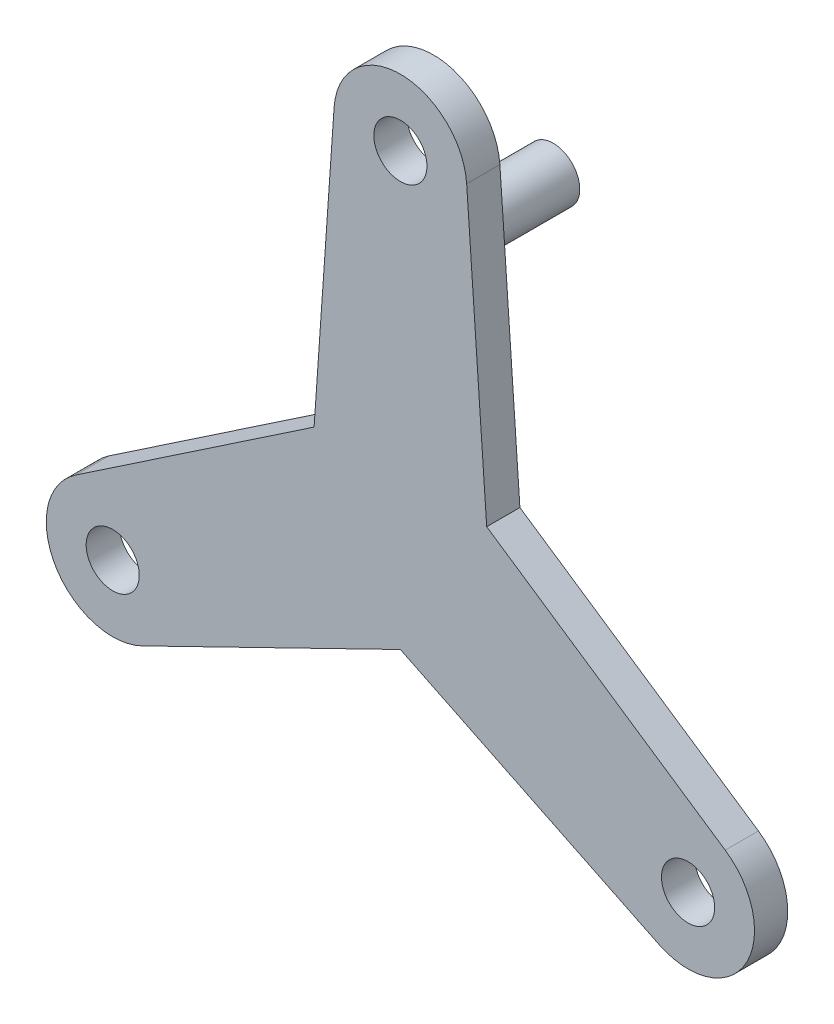
ISO-10303-21;
HEADER;
FILE_DESCRIPTION(('STEP AP214'),'2;1');
FILE_NAME('part.step','',(''),(''),'','','');
FILE_SCHEMA(('AUTOMOTIVE_DESIGN { 1 0 10303 214 1 1 1 1 }'));
ENDSEC;
DATA;
#1=APPLICATION_CONTEXT('core data for automotive mechanical design processes');
#2=APPLICATION_PROTOCOL_DEFINITION('international standard','automotive_design',2000,#1);
#3=PRODUCT_CONTEXT('',#1,'mechanical');
#4=PRODUCT('Part','Part','',(#3));
#5=PRODUCT_RELATED_PRODUCT_CATEGORY('part','',(#4));
#6=PRODUCT_DEFINITION_FORMATION('','',#4);
#7=PRODUCT_DEFINITION_CONTEXT('part definition',#1,'design');
#8=PRODUCT_DEFINITION('design','',#6,#7);
#9=PRODUCT_DEFINITION_SHAPE('','',#8);
#10=(LENGTH_UNIT() NAMED_UNIT(*) SI_UNIT(.MILLI.,.METRE.));
#11=(NAMED_UNIT(*) PLANE_ANGLE_UNIT() SI_UNIT($,.RADIAN.));
#12=(NAMED_UNIT(*) SI_UNIT($,.STERADIAN.) SOLID_ANGLE_UNIT());
#13=UNCERTAINTY_MEASURE_WITH_UNIT(LENGTH_MEASURE(1.E-05),#10,'distance_accuracy_value','');
#14=(GEOMETRIC_REPRESENTATION_CONTEXT(3) GLOBAL_UNCERTAINTY_ASSIGNED_CONTEXT((#13)) GLOBAL_UNIT_ASSIGNED_CONTEXT((#10,
#11,#12)) REPRESENTATION_CONTEXT('',''));
#15=CARTESIAN_POINT('',(0.,0.,0.));
#16=DIRECTION('',(0.,0.,1.));
#17=DIRECTION('',(1.,0.,0.));
#18=AXIS2_PLACEMENT_3D('',#15,#16,#17);
#19=CARTESIAN_POINT('',(48.8920670997291,-66.7088607594935,5.));
#20=DIRECTION('',(-0.559079691050712,-0.829113924050634,0.));
#21=DIRECTION('',(0.829113924050634,-0.559079691050712,0.));
#22=AXIS2_PLACEMENT_3D('',#19,#20,#21);
#23=PLANE('',#22);
#24=DIRECTION('',(-0.829113924050634,0.559079691050712,0.));
#25=VECTOR('',#24,1.);
#26=CARTESIAN_POINT('',(48.8920670997291,-66.7088607594935,0.));
#27=LINE('',#26,#25);
#28=CARTESIAN_POINT('',(48.8920670997291,-66.7088607594935,0.));
#29=VERTEX_POINT('',#28);
#30=CARTESIAN_POINT('',(12.9903810567665,-42.4999999999999,0.));
#31=VERTEX_POINT('',#30);
#32=EDGE_CURVE('E140',#29,#31,#27,.T.);
#33=ORIENTED_EDGE('',*,*,#32,.T.);
#34=DIRECTION('',(0.,0.,-1.));
#35=VECTOR('',#34,1.);
#36=CARTESIAN_POINT('',(12.9903810567665,-42.4999999999999,5.));
#37=LINE('',#36,#35);
#38=CARTESIAN_POINT('',(12.9903810567665,-42.4999999999999,5.));
#39=VERTEX_POINT('',#38);
#40=EDGE_CURVE('E11',#39,#31,#37,.T.);
#41=ORIENTED_EDGE('',*,*,#40,.F.);
#42=DIRECTION('',(-0.829113924050634,0.559079691050712,0.));
#43=VECTOR('',#42,1.);
#44=CARTESIAN_POINT('',(48.8920670997291,-66.7088607594935,5.));
#45=LINE('',#44,#43);
#46=CARTESIAN_POINT('',(48.8920670997291,-66.7088607594935,5.));
#47=VERTEX_POINT('',#46);
#48=EDGE_CURVE('E162',#47,#39,#45,.T.);
#49=ORIENTED_EDGE('',*,*,#48,.F.);
#50=DIRECTION('',(0.,0.,-1.));
#51=VECTOR('',#50,1.);
#52=CARTESIAN_POINT('',(48.8920670997291,-66.7088607594935,5.));
#53=LINE('',#52,#51);
#54=EDGE_CURVE('E53',#47,#29,#53,.T.);
#55=ORIENTED_EDGE('',*,*,#54,.T.);
#56=EDGE_LOOP('',(#33,#41,#49,#55));
#57=FACE_BOUND('',#56,.T.);
#58=ADVANCED_FACE('F37',(#57),#23,.F.);
#59=CARTESIAN_POINT('',(12.9903810567665,-42.4999999999999,5.));
#60=DIRECTION('',(-0.997573566384607,-0.0696202531645562,0.));
#61=DIRECTION('',(0.0696202531645562,-0.997573566384607,0.));
#62=AXIS2_PLACEMENT_3D('',#59,#60,#61);
#63=PLANE('',#62);
#64=DIRECTION('',(-0.0696202531645562,0.997573566384607,0.));
#65=VECTOR('',#64,1.);
#66=CARTESIAN_POINT('',(12.9903810567665,-42.4999999999999,0.));
#67=LINE('',#66,#65);
#68=CARTESIAN_POINT('',(9.97573566384607,0.696202531645563,0.));
#69=VERTEX_POINT('',#68);
#70=EDGE_CURVE('E142',#31,#69,#67,.T.);
#71=ORIENTED_EDGE('',*,*,#70,.T.);
#72=DIRECTION('',(0.,0.,-1.));
#73=VECTOR('',#72,1.);
#74=CARTESIAN_POINT('',(9.97573566384607,0.696202531645563,5.));
#75=LINE('',#74,#73);
#76=CARTESIAN_POINT('',(9.97573566384607,0.696202531645563,5.));
#77=VERTEX_POINT('',#76);
#78=EDGE_CURVE('E45',#77,#69,#75,.T.);
#79=ORIENTED_EDGE('',*,*,#78,.F.);
#80=DIRECTION('',(-0.0696202531645562,0.997573566384607,0.));
#81=VECTOR('',#80,1.);
#82=CARTESIAN_POINT('',(12.9903810567665,-42.4999999999999,5.));
#83=LINE('',#82,#81);
#84=EDGE_CURVE('E95',#39,#77,#83,.T.);
#85=ORIENTED_EDGE('',*,*,#84,.F.);
#86=ORIENTED_EDGE('',*,*,#40,.T.);
#87=EDGE_LOOP('',(#71,#79,#85,#86));
#88=FACE_BOUND('',#87,.T.);
#89=ADVANCED_FACE('F178',(#88),#63,.F.);
#90=CARTESIAN_POINT('',(0.,0.,5.));
#91=DIRECTION('',(0.,0.,-1.));
#92=DIRECTION('',(-1.,0.,0.));
#93=AXIS2_PLACEMENT_3D('',#90,#91,#92);
#94=CYLINDRICAL_SURFACE('',#93,10.);
#95=CARTESIAN_POINT('',(0.,0.,0.));
#96=DIRECTION('',(0.,0.,-1.));
#97=DIRECTION('',(-1.,0.,0.));
#98=AXIS2_PLACEMENT_3D('',#95,#96,#97);
#99=CIRCLE('',#98,10.);
#100=CARTESIAN_POINT('',(-9.97573566384607,0.696202531645561,0.));
#101=VERTEX_POINT('',#100);
#102=EDGE_CURVE('E146',#101,#69,#99,.T.);
#103=ORIENTED_EDGE('',*,*,#102,.F.);
#104=DIRECTION('',(0.,0.,-1.));
#105=VECTOR('',#104,1.);
#106=CARTESIAN_POINT('',(-9.97573566384607,0.696202531645561,5.));
#107=LINE('',#106,#105);
#108=CARTESIAN_POINT('',(-9.97573566384607,0.696202531645561,5.));
#109=VERTEX_POINT('',#108);
#110=EDGE_CURVE('E171',#109,#101,#107,.T.);
#111=ORIENTED_EDGE('',*,*,#110,.F.);
#112=CARTESIAN_POINT('',(0.,0.,5.));
#113=DIRECTION('',(0.,0.,-1.));
#114=DIRECTION('',(-1.,0.,0.));
#115=AXIS2_PLACEMENT_3D('',#112,#113,#114);
#116=CIRCLE('',#115,10.);
#117=EDGE_CURVE('E177',#109,#77,#116,.T.);
#118=ORIENTED_EDGE('',*,*,#117,.T.);
#119=ORIENTED_EDGE('',*,*,#78,.T.);
#120=EDGE_LOOP('',(#103,#111,#118,#119));
#121=FACE_BOUND('',#120,.T.);
#122=ADVANCED_FACE('F175',(#121),#94,.T.);
#123=CARTESIAN_POINT('',(-12.9903810567665,-42.4999999999999,5.));
#124=DIRECTION('',(-0.997573566384607,0.0696202531645559,0.));
#125=DIRECTION('',(-0.0696202531645559,-0.997573566384607,0.));
#126=AXIS2_PLACEMENT_3D('',#123,#124,#125);
#127=PLANE('',#126);
#128=DIRECTION('',(0.0696202531645559,0.997573566384607,0.));
#129=VECTOR('',#128,1.);
#130=CARTESIAN_POINT('',(-12.9903810567665,-42.4999999999999,0.));
#131=LINE('',#130,#129);
#132=CARTESIAN_POINT('',(-12.9903810567665,-42.4999999999999,0.));
#133=VERTEX_POINT('',#132);
#134=EDGE_CURVE('E149',#133,#101,#131,.T.);
#135=ORIENTED_EDGE('',*,*,#134,.F.);
#136=DIRECTION('',(0.,0.,-1.));
#137=VECTOR('',#136,1.);
#138=CARTESIAN_POINT('',(-12.9903810567665,-42.4999999999999,5.));
#139=LINE('',#138,#137);
#140=CARTESIAN_POINT('',(-12.9903810567665,-42.4999999999999,5.));
#141=VERTEX_POINT('',#140);
#142=EDGE_CURVE('E169',#141,#133,#139,.T.);
#143=ORIENTED_EDGE('',*,*,#142,.F.);
#144=DIRECTION('',(0.0696202531645559,0.997573566384607,0.));
#145=VECTOR('',#144,1.);
#146=CARTESIAN_POINT('',(-12.9903810567665,-42.4999999999999,5.));
#147=LINE('',#146,#145);
#148=EDGE_CURVE('E190',#141,#109,#147,.T.);
#149=ORIENTED_EDGE('',*,*,#148,.T.);
#150=ORIENTED_EDGE('',*,*,#110,.T.);
#151=EDGE_LOOP('',(#135,#143,#149,#150));
#152=FACE_BOUND('',#151,.T.);
#153=ADVANCED_FACE('F186',(#152),#127,.T.);
#154=CARTESIAN_POINT('',(-12.9903810567665,-42.4999999999999,5.));
#155=DIRECTION('',(0.559079691050712,-0.829113924050634,0.));
#156=DIRECTION('',(0.829113924050634,0.559079691050712,0.));
#157=AXIS2_PLACEMENT_3D('',#154,#155,#156);
#158=PLANE('',#157);
#159=DIRECTION('',(-0.829113924050634,-0.559079691050712,0.));
#160=VECTOR('',#159,1.);
#161=CARTESIAN_POINT('',(-12.9903810567665,-42.4999999999999,0.));
#162=LINE('',#161,#160);
#163=CARTESIAN_POINT('',(-48.8920670997291,-66.7088607594936,0.));
#164=VERTEX_POINT('',#163);
#165=EDGE_CURVE('E152',#133,#164,#162,.T.);
#166=ORIENTED_EDGE('',*,*,#165,.T.);
#167=DIRECTION('',(0.,0.,-1.));
#168=VECTOR('',#167,1.);
#169=CARTESIAN_POINT('',(-48.8920670997291,-66.7088607594936,5.));
#170=LINE('',#169,#168);
#171=CARTESIAN_POINT('',(-48.8920670997291,-66.7088607594936,5.));
#172=VERTEX_POINT('',#171);
#173=EDGE_CURVE('E166',#172,#164,#170,.T.);
#174=ORIENTED_EDGE('',*,*,#173,.F.);
#175=DIRECTION('',(-0.829113924050634,-0.559079691050712,0.));
#176=VECTOR('',#175,1.);
#177=CARTESIAN_POINT('',(-12.9903810567665,-42.4999999999999,5.));
#178=LINE('',#177,#176);
#179=EDGE_CURVE('E192',#141,#172,#178,.T.);
#180=ORIENTED_EDGE('',*,*,#179,.F.);
#181=ORIENTED_EDGE('',*,*,#142,.T.);
#182=EDGE_LOOP('',(#166,#174,#180,#181));
#183=FACE_BOUND('',#182,.T.);
#184=ADVANCED_FACE('F199',(#183),#158,.F.);
#185=CARTESIAN_POINT('',(-43.301270189222,-74.9999999999999,5.));
#186=DIRECTION('',(0.,0.,-1.));
#187=DIRECTION('',(-1.,0.,0.));
#188=AXIS2_PLACEMENT_3D('',#185,#186,#187);
#189=CYLINDRICAL_SURFACE('',#188,10.);
#190=CARTESIAN_POINT('',(-43.301270189222,-74.9999999999999,0.));
#191=DIRECTION('',(0.,0.,1.));
#192=DIRECTION('',(1.,0.,0.));
#193=AXIS2_PLACEMENT_3D('',#190,#191,#192);
#194=CIRCLE('',#193,10.);
#195=CARTESIAN_POINT('',(-38.9163314358831,-83.9873417721518,0.));
#196=VERTEX_POINT('',#195);
#197=EDGE_CURVE('E154',#164,#196,#194,.T.);
#198=ORIENTED_EDGE('',*,*,#197,.T.);
#199=DIRECTION('',(0.,0.,-1.));
#200=VECTOR('',#199,1.);
#201=CARTESIAN_POINT('',(-38.9163314358831,-83.9873417721518,5.));
#202=LINE('',#201,#200);
#203=CARTESIAN_POINT('',(-38.9163314358831,-83.9873417721518,5.));
#204=VERTEX_POINT('',#203);
#205=EDGE_CURVE('E132',#204,#196,#202,.T.);
#206=ORIENTED_EDGE('',*,*,#205,.F.);
#207=CARTESIAN_POINT('',(-43.301270189222,-74.9999999999999,5.));
#208=DIRECTION('',(0.,0.,1.));
#209=DIRECTION('',(1.,0.,0.));
#210=AXIS2_PLACEMENT_3D('',#207,#208,#209);
#211=CIRCLE('',#210,10.);
#212=EDGE_CURVE('E120',#172,#204,#211,.T.);
#213=ORIENTED_EDGE('',*,*,#212,.F.);
#214=ORIENTED_EDGE('',*,*,#173,.T.);
#215=EDGE_LOOP('',(#198,#206,#213,#214));
#216=FACE_BOUND('',#215,.T.);
#217=ADVANCED_FACE('F201',(#216),#189,.T.);
#218=CARTESIAN_POINT('',(-38.9163314358831,-83.9873417721518,5.));
#219=DIRECTION('',(-0.438493875333891,0.898734177215191,0.));
#220=DIRECTION('',(-0.898734177215191,-0.438493875333891,0.));
#221=AXIS2_PLACEMENT_3D('',#218,#219,#220);
#222=PLANE('',#221);
#223=DIRECTION('',(0.898734177215191,0.43849387533389,0.));
#224=VECTOR('',#223,1.);
#225=CARTESIAN_POINT('',(-38.9163314358831,-83.9873417721518,0.));
#226=LINE('',#225,#224);
#227=CARTESIAN_POINT('',(0.,-65.,0.));
#228=VERTEX_POINT('',#227);
#229=EDGE_CURVE('E129',#196,#228,#226,.T.);
#230=ORIENTED_EDGE('',*,*,#229,.T.);
#231=DIRECTION('',(0.,0.,-1.));
#232=VECTOR('',#231,1.);
#233=CARTESIAN_POINT('',(0.,-65.,5.));
#234=LINE('',#233,#232);
#235=CARTESIAN_POINT('',(0.,-65.,5.));
#236=VERTEX_POINT('',#235);
#237=EDGE_CURVE('E126',#236,#228,#234,.T.);
#238=ORIENTED_EDGE('',*,*,#237,.F.);
#239=DIRECTION('',(0.898734177215191,0.43849387533389,0.));
#240=VECTOR('',#239,1.);
#241=CARTESIAN_POINT('',(-38.9163314358831,-83.9873417721518,5.));
#242=LINE('',#241,#240);
#243=EDGE_CURVE('E113',#204,#236,#242,.T.);
#244=ORIENTED_EDGE('',*,*,#243,.F.);
#245=ORIENTED_EDGE('',*,*,#205,.T.);
#246=EDGE_LOOP('',(#230,#238,#244,#245));
#247=FACE_BOUND('',#246,.T.);
#248=ADVANCED_FACE('F127',(#247),#222,.F.);
#249=CARTESIAN_POINT('',(0.,-65.,5.));
#250=DIRECTION('',(0.43849387533389,0.898734177215191,0.));
#251=DIRECTION('',(-0.898734177215191,0.43849387533389,0.));
#252=AXIS2_PLACEMENT_3D('',#249,#250,#251);
#253=PLANE('',#252);
#254=DIRECTION('',(0.898734177215191,-0.43849387533389,0.));
#255=VECTOR('',#254,1.);
#256=CARTESIAN_POINT('',(0.,-65.,0.));
#257=LINE('',#256,#255);
#258=CARTESIAN_POINT('',(38.9163314358831,-83.9873417721518,0.));
#259=VERTEX_POINT('',#258);
#260=EDGE_CURVE('E157',#228,#259,#257,.T.);
#261=ORIENTED_EDGE('',*,*,#260,.T.);
#262=DIRECTION('',(0.,0.,-1.));
#263=VECTOR('',#262,1.);
#264=CARTESIAN_POINT('',(38.9163314358831,-83.9873417721518,5.));
#265=LINE('',#264,#263);
#266=CARTESIAN_POINT('',(38.9163314358831,-83.9873417721518,5.));
#267=VERTEX_POINT('',#266);
#268=EDGE_CURVE('E83',#267,#259,#265,.T.);
#269=ORIENTED_EDGE('',*,*,#268,.F.);
#270=DIRECTION('',(0.898734177215191,-0.43849387533389,0.));
#271=VECTOR('',#270,1.);
#272=CARTESIAN_POINT('',(0.,-65.,5.));
#273=LINE('',#272,#271);
#274=EDGE_CURVE('E118',#236,#267,#273,.T.);
#275=ORIENTED_EDGE('',*,*,#274,.F.);
#276=ORIENTED_EDGE('',*,*,#237,.T.);
#277=EDGE_LOOP('',(#261,#269,#275,#276));
#278=FACE_BOUND('',#277,.T.);
#279=ADVANCED_FACE('F134',(#278),#253,.F.);
#280=CARTESIAN_POINT('',(43.301270189222,-74.9999999999999,5.));
#281=DIRECTION('',(0.,0.,-1.));
#282=DIRECTION('',(-1.,0.,0.));
#283=AXIS2_PLACEMENT_3D('',#280,#281,#282);
#284=CYLINDRICAL_SURFACE('',#283,10.);
#285=CARTESIAN_POINT('',(43.301270189222,-74.9999999999999,0.));
#286=DIRECTION('',(0.,0.,-1.));
#287=DIRECTION('',(-1.,0.,0.));
#288=AXIS2_PLACEMENT_3D('',#285,#286,#287);
#289=CIRCLE('',#288,10.);
#290=EDGE_CURVE('E159',#29,#259,#289,.T.);
#291=ORIENTED_EDGE('',*,*,#290,.F.);
#292=ORIENTED_EDGE('',*,*,#54,.F.);
#293=CARTESIAN_POINT('',(43.301270189222,-74.9999999999999,5.));
#294=DIRECTION('',(0.,0.,-1.));
#295=DIRECTION('',(-1.,0.,0.));
#296=AXIS2_PLACEMENT_3D('',#293,#294,#295);
#297=CIRCLE('',#296,10.);
#298=EDGE_CURVE('E135',#47,#267,#297,.T.);
#299=ORIENTED_EDGE('',*,*,#298,.T.);
#300=ORIENTED_EDGE('',*,*,#268,.T.);
#301=EDGE_LOOP('',(#291,#292,#299,#300));
#302=FACE_BOUND('',#301,.T.);
#303=ADVANCED_FACE('F202',(#302),#284,.T.);
#304=CARTESIAN_POINT('',(0.,0.,5.));
#305=DIRECTION('',(0.,0.,-1.));
#306=DIRECTION('',(-1.,0.,0.));
#307=AXIS2_PLACEMENT_3D('',#304,#305,#306);
#308=PLANE('',#307);
#309=CARTESIAN_POINT('',(0.,0.,5.));
#310=DIRECTION('',(0.,0.,-1.));
#311=DIRECTION('',(-1.,0.,0.));
#312=AXIS2_PLACEMENT_3D('',#309,#310,#311);
#313=CIRCLE('',#312,4.);
#314=CARTESIAN_POINT('',(-4.,0.,5.));
#315=VERTEX_POINT('',#314);
#316=EDGE_CURVE('E231',#315,#315,#313,.T.);
#317=ORIENTED_EDGE('',*,*,#316,.T.);
#318=EDGE_LOOP('',(#317));
#319=FACE_BOUND('',#318,.T.);
#320=CARTESIAN_POINT('',(43.301270189222,-74.9999999999999,5.));
#321=DIRECTION('',(0.,0.,-1.));
#322=DIRECTION('',(-1.,0.,0.));
#323=AXIS2_PLACEMENT_3D('',#320,#321,#322);
#324=CIRCLE('',#323,4.);
#325=CARTESIAN_POINT('',(39.301270189222,-74.9999999999999,5.));
#326=VERTEX_POINT('',#325);
#327=EDGE_CURVE('E225',#326,#326,#324,.T.);
#328=ORIENTED_EDGE('',*,*,#327,.T.);
#329=EDGE_LOOP('',(#328));
#330=FACE_BOUND('',#329,.T.);
#331=CARTESIAN_POINT('',(-43.301270189222,-74.9999999999999,5.));
#332=DIRECTION('',(0.,0.,-1.));
#333=DIRECTION('',(-1.,0.,0.));
#334=AXIS2_PLACEMENT_3D('',#331,#332,#333);
#335=CIRCLE('',#334,4.00000000000001);
#336=CARTESIAN_POINT('',(-47.301270189222,-74.9999999999999,5.));
#337=VERTEX_POINT('',#336);
#338=EDGE_CURVE('E218',#337,#337,#335,.T.);
#339=ORIENTED_EDGE('',*,*,#338,.T.);
#340=EDGE_LOOP('',(#339));
#341=FACE_BOUND('',#340,.T.);
#342=ORIENTED_EDGE('',*,*,#48,.T.);
#343=ORIENTED_EDGE('',*,*,#84,.T.);
#344=ORIENTED_EDGE('',*,*,#117,.F.);
#345=ORIENTED_EDGE('',*,*,#148,.F.);
#346=ORIENTED_EDGE('',*,*,#179,.T.);
#347=ORIENTED_EDGE('',*,*,#212,.T.);
#348=ORIENTED_EDGE('',*,*,#243,.T.);
#349=ORIENTED_EDGE('',*,*,#274,.T.);
#350=ORIENTED_EDGE('',*,*,#298,.F.);
#351=EDGE_LOOP('',(#342,#343,#344,#345,#346,#347,#348,#349,#350));
#352=FACE_BOUND('',#351,.T.);
#353=ADVANCED_FACE('F115',(#319,#330,#341,#352),#308,.F.);
#354=CARTESIAN_POINT('',(0.,0.,0.));
#355=DIRECTION('',(0.,0.,-1.));
#356=DIRECTION('',(-1.,0.,0.));
#357=AXIS2_PLACEMENT_3D('',#354,#355,#356);
#358=PLANE('',#357);
#359=CARTESIAN_POINT('',(0.,-14.5,0.));
#360=DIRECTION('',(0.,0.,-1.));
#361=DIRECTION('',(-1.,0.,0.));
#362=AXIS2_PLACEMENT_3D('',#359,#360,#361);
#363=CIRCLE('',#362,4.);
#364=CARTESIAN_POINT('',(-3.99999999999999,-14.5,0.));
#365=VERTEX_POINT('',#364);
#366=EDGE_CURVE('E236',#365,#365,#363,.T.);
#367=ORIENTED_EDGE('',*,*,#366,.F.);
#368=EDGE_LOOP('',(#367));
#369=FACE_BOUND('',#368,.T.);
#370=CARTESIAN_POINT('',(0.,0.,0.));
#371=DIRECTION('',(0.,0.,-1.));
#372=DIRECTION('',(-1.,0.,0.));
#373=AXIS2_PLACEMENT_3D('',#370,#371,#372);
#374=CIRCLE('',#373,4.);
#375=CARTESIAN_POINT('',(-4.,0.,0.));
#376=VERTEX_POINT('',#375);
#377=EDGE_CURVE('E143',#376,#376,#374,.T.);
#378=ORIENTED_EDGE('',*,*,#377,.F.);
#379=EDGE_LOOP('',(#378));
#380=FACE_BOUND('',#379,.T.);
#381=CARTESIAN_POINT('',(43.301270189222,-74.9999999999999,0.));
#382=DIRECTION('',(0.,0.,-1.));
#383=DIRECTION('',(-1.,0.,0.));
#384=AXIS2_PLACEMENT_3D('',#381,#382,#383);
#385=CIRCLE('',#384,4.);
#386=CARTESIAN_POINT('',(39.301270189222,-74.9999999999999,0.));
#387=VERTEX_POINT('',#386);
#388=EDGE_CURVE('E228',#387,#387,#385,.T.);
#389=ORIENTED_EDGE('',*,*,#388,.F.);
#390=EDGE_LOOP('',(#389));
#391=FACE_BOUND('',#390,.T.);
#392=CARTESIAN_POINT('',(-43.301270189222,-74.9999999999999,0.));
#393=DIRECTION('',(0.,0.,-1.));
#394=DIRECTION('',(-1.,0.,0.));
#395=AXIS2_PLACEMENT_3D('',#392,#393,#394);
#396=CIRCLE('',#395,4.00000000000001);
#397=CARTESIAN_POINT('',(-47.301270189222,-74.9999999999999,0.));
#398=VERTEX_POINT('',#397);
#399=EDGE_CURVE('E221',#398,#398,#396,.T.);
#400=ORIENTED_EDGE('',*,*,#399,.F.);
#401=EDGE_LOOP('',(#400));
#402=FACE_BOUND('',#401,.T.);
#403=ORIENTED_EDGE('',*,*,#32,.F.);
#404=ORIENTED_EDGE('',*,*,#290,.T.);
#405=ORIENTED_EDGE('',*,*,#260,.F.);
#406=ORIENTED_EDGE('',*,*,#229,.F.);
#407=ORIENTED_EDGE('',*,*,#197,.F.);
#408=ORIENTED_EDGE('',*,*,#165,.F.);
#409=ORIENTED_EDGE('',*,*,#134,.T.);
#410=ORIENTED_EDGE('',*,*,#102,.T.);
#411=ORIENTED_EDGE('',*,*,#70,.F.);
#412=EDGE_LOOP('',(#403,#404,#405,#406,#407,#408,#409,#410,#411));
#413=FACE_BOUND('',#412,.T.);
#414=ADVANCED_FACE('F181',(#369,#380,#391,#402,#413),#358,.T.);
#415=CARTESIAN_POINT('',(-43.301270189222,-74.9999999999999,5.));
#416=DIRECTION('',(0.,0.,-1.));
#417=DIRECTION('',(-1.,0.,0.));
#418=AXIS2_PLACEMENT_3D('',#415,#416,#417);
#419=CYLINDRICAL_SURFACE('',#418,4.00000000000001);
#420=ORIENTED_EDGE('',*,*,#338,.F.);
#421=EDGE_LOOP('',(#420));
#422=FACE_BOUND('',#421,.T.);
#423=ORIENTED_EDGE('',*,*,#399,.T.);
#424=EDGE_LOOP('',(#423));
#425=FACE_BOUND('',#424,.T.);
#426=ADVANCED_FACE('F253',(#422,#425),#419,.F.);
#427=CARTESIAN_POINT('',(43.301270189222,-74.9999999999999,5.));
#428=DIRECTION('',(0.,0.,-1.));
#429=DIRECTION('',(-1.,0.,0.));
#430=AXIS2_PLACEMENT_3D('',#427,#428,#429);
#431=CYLINDRICAL_SURFACE('',#430,4.);
#432=ORIENTED_EDGE('',*,*,#327,.F.);
#433=EDGE_LOOP('',(#432));
#434=FACE_BOUND('',#433,.T.);
#435=ORIENTED_EDGE('',*,*,#388,.T.);
#436=EDGE_LOOP('',(#435));
#437=FACE_BOUND('',#436,.T.);
#438=ADVANCED_FACE('F261',(#434,#437),#431,.F.);
#439=CARTESIAN_POINT('',(0.,0.,5.));
#440=DIRECTION('',(0.,0.,-1.));
#441=DIRECTION('',(-1.,0.,0.));
#442=AXIS2_PLACEMENT_3D('',#439,#440,#441);
#443=CYLINDRICAL_SURFACE('',#442,4.);
#444=ORIENTED_EDGE('',*,*,#316,.F.);
#445=EDGE_LOOP('',(#444));
#446=FACE_BOUND('',#445,.T.);
#447=ORIENTED_EDGE('',*,*,#377,.T.);
#448=EDGE_LOOP('',(#447));
#449=FACE_BOUND('',#448,.T.);
#450=ADVANCED_FACE('F247',(#446,#449),#443,.F.);
#451=CARTESIAN_POINT('',(0.,-14.5,-18.));
#452=DIRECTION('',(0.,0.,1.));
#453=DIRECTION('',(1.,0.,0.));
#454=AXIS2_PLACEMENT_3D('',#451,#452,#453);
#455=CYLINDRICAL_SURFACE('',#454,4.);
#456=CARTESIAN_POINT('',(0.,-14.5,-18.));
#457=DIRECTION('',(0.,0.,-1.));
#458=DIRECTION('',(-1.,0.,0.));
#459=AXIS2_PLACEMENT_3D('',#456,#457,#458);
#460=CIRCLE('',#459,4.);
#461=CARTESIAN_POINT('',(-3.99999999999999,-14.5,-18.));
#462=VERTEX_POINT('',#461);
#463=EDGE_CURVE('E222',#462,#462,#460,.T.);
#464=ORIENTED_EDGE('',*,*,#463,.F.);
#465=EDGE_LOOP('',(#464));
#466=FACE_BOUND('',#465,.T.);
#467=ORIENTED_EDGE('',*,*,#366,.T.);
#468=EDGE_LOOP('',(#467));
#469=FACE_BOUND('',#468,.T.);
#470=ADVANCED_FACE('F244',(#466,#469),#455,.T.);
#471=CARTESIAN_POINT('',(0.,-14.5,-18.));
#472=DIRECTION('',(0.,0.,-1.));
#473=DIRECTION('',(-1.,0.,0.));
#474=AXIS2_PLACEMENT_3D('',#471,#472,#473);
#475=PLANE('',#474);
#476=ORIENTED_EDGE('',*,*,#463,.T.);
#477=EDGE_LOOP('',(#476));
#478=FACE_BOUND('',#477,.T.);
#479=ADVANCED_FACE('F242',(#478),#475,.T.);
#480=CLOSED_SHELL('',(#58,#89,#122,#153,#184,#217,#248,#279,#303,#353,#414,#426,#438,#450,#470,#479));
#481=MANIFOLD_SOLID_BREP('B2',#480);
#482=ADVANCED_BREP_SHAPE_REPRESENTATION('',(#18,#481),#14);
#483=SHAPE_DEFINITION_REPRESENTATION(#9,#482);
ENDSEC;
END-ISO-10303-21;
